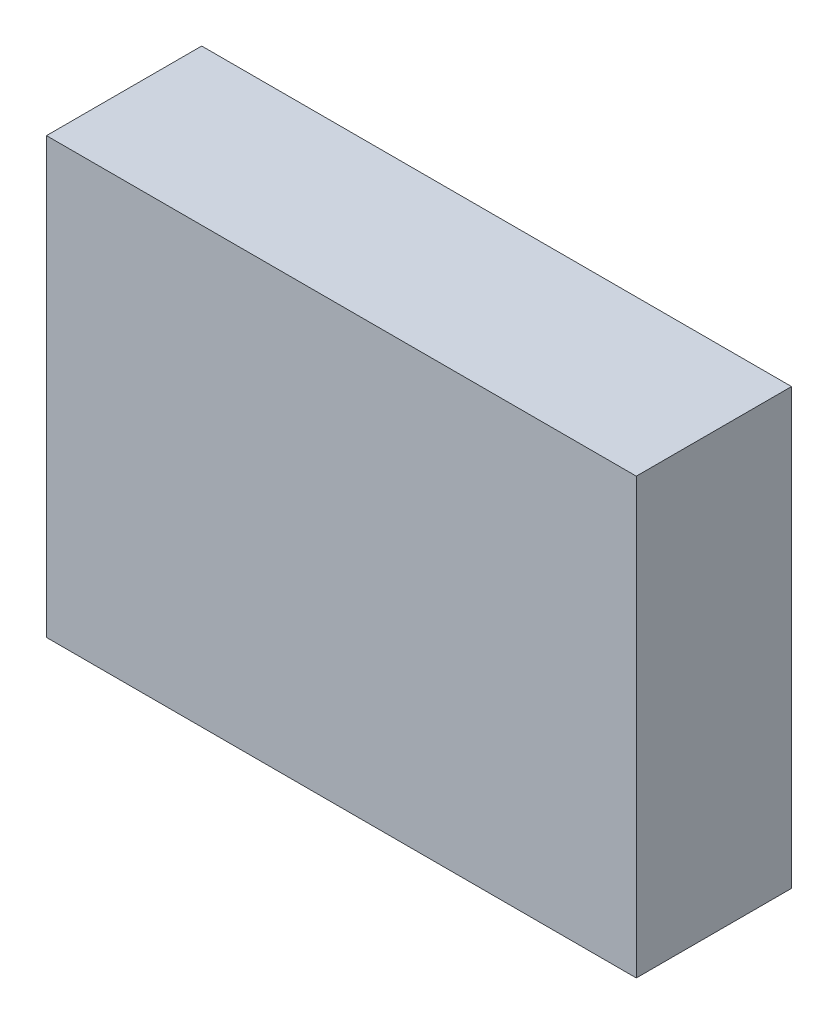
ISO-10303-21;
HEADER;
FILE_DESCRIPTION(('STEP AP214'),'2;1');
FILE_NAME('part.step','',(''),(''),'','','');
FILE_SCHEMA(('AUTOMOTIVE_DESIGN { 1 0 10303 214 1 1 1 1 }'));
ENDSEC;
DATA;
#1=APPLICATION_CONTEXT('core data for automotive mechanical design processes');
#2=APPLICATION_PROTOCOL_DEFINITION('international standard','automotive_design',2000,#1);
#3=PRODUCT_CONTEXT('',#1,'mechanical');
#4=PRODUCT('Part','Part','',(#3));
#5=PRODUCT_RELATED_PRODUCT_CATEGORY('part','',(#4));
#6=PRODUCT_DEFINITION_FORMATION('','',#4);
#7=PRODUCT_DEFINITION_CONTEXT('part definition',#1,'design');
#8=PRODUCT_DEFINITION('design','',#6,#7);
#9=PRODUCT_DEFINITION_SHAPE('','',#8);
#10=(LENGTH_UNIT() NAMED_UNIT(*) SI_UNIT(.MILLI.,.METRE.));
#11=(NAMED_UNIT(*) PLANE_ANGLE_UNIT() SI_UNIT($,.RADIAN.));
#12=(NAMED_UNIT(*) SI_UNIT($,.STERADIAN.) SOLID_ANGLE_UNIT());
#13=UNCERTAINTY_MEASURE_WITH_UNIT(LENGTH_MEASURE(1.E-05),#10,'distance_accuracy_value','');
#14=(GEOMETRIC_REPRESENTATION_CONTEXT(3) GLOBAL_UNCERTAINTY_ASSIGNED_CONTEXT((#13)) GLOBAL_UNIT_ASSIGNED_CONTEXT((#10,
#11,#12)) REPRESENTATION_CONTEXT('',''));
#15=CARTESIAN_POINT('',(0.,0.,0.));
#16=DIRECTION('',(0.,0.,1.));
#17=DIRECTION('',(1.,0.,0.));
#18=AXIS2_PLACEMENT_3D('',#15,#16,#17);
#19=CARTESIAN_POINT('',(95.,-70.,50.));
#20=DIRECTION('',(-1.,0.,0.));
#21=DIRECTION('',(0.,0.,1.));
#22=AXIS2_PLACEMENT_3D('',#19,#20,#21);
#23=PLANE('',#22);
#24=DIRECTION('',(0.,1.,0.));
#25=VECTOR('',#24,1.);
#26=CARTESIAN_POINT('',(95.,-70.,0.));
#27=LINE('',#26,#25);
#28=CARTESIAN_POINT('',(95.,-70.,0.));
#29=VERTEX_POINT('',#28);
#30=CARTESIAN_POINT('',(95.,70.,0.));
#31=VERTEX_POINT('',#30);
#32=EDGE_CURVE('E96',#29,#31,#27,.T.);
#33=ORIENTED_EDGE('',*,*,#32,.T.);
#34=DIRECTION('',(0.,0.,-1.));
#35=VECTOR('',#34,1.);
#36=CARTESIAN_POINT('',(95.,70.,50.));
#37=LINE('',#36,#35);
#38=CARTESIAN_POINT('',(95.,70.,50.));
#39=VERTEX_POINT('',#38);
#40=EDGE_CURVE('E11',#39,#31,#37,.T.);
#41=ORIENTED_EDGE('',*,*,#40,.F.);
#42=DIRECTION('',(0.,1.,0.));
#43=VECTOR('',#42,1.);
#44=CARTESIAN_POINT('',(95.,-70.,50.));
#45=LINE('',#44,#43);
#46=CARTESIAN_POINT('',(95.,-70.,50.));
#47=VERTEX_POINT('',#46);
#48=EDGE_CURVE('E84',#47,#39,#45,.T.);
#49=ORIENTED_EDGE('',*,*,#48,.F.);
#50=DIRECTION('',(0.,0.,-1.));
#51=VECTOR('',#50,1.);
#52=CARTESIAN_POINT('',(95.,-70.,50.));
#53=LINE('',#52,#51);
#54=EDGE_CURVE('E92',#47,#29,#53,.T.);
#55=ORIENTED_EDGE('',*,*,#54,.T.);
#56=EDGE_LOOP('',(#33,#41,#49,#55));
#57=FACE_BOUND('',#56,.T.);
#58=ADVANCED_FACE('F33',(#57),#23,.F.);
#59=CARTESIAN_POINT('',(-95.,70.,50.));
#60=DIRECTION('',(0.,-1.,0.));
#61=DIRECTION('',(0.,0.,-1.));
#62=AXIS2_PLACEMENT_3D('',#59,#60,#61);
#63=PLANE('',#62);
#64=DIRECTION('',(-1.,0.,0.));
#65=VECTOR('',#64,1.);
#66=CARTESIAN_POINT('',(-95.,70.,0.));
#67=LINE('',#66,#65);
#68=CARTESIAN_POINT('',(-95.,70.,0.));
#69=VERTEX_POINT('',#68);
#70=EDGE_CURVE('E88',#31,#69,#67,.T.);
#71=ORIENTED_EDGE('',*,*,#70,.T.);
#72=DIRECTION('',(0.,0.,-1.));
#73=VECTOR('',#72,1.);
#74=CARTESIAN_POINT('',(-95.,70.,50.));
#75=LINE('',#74,#73);
#76=CARTESIAN_POINT('',(-95.,70.,50.));
#77=VERTEX_POINT('',#76);
#78=EDGE_CURVE('E41',#77,#69,#75,.T.);
#79=ORIENTED_EDGE('',*,*,#78,.F.);
#80=DIRECTION('',(-1.,0.,0.));
#81=VECTOR('',#80,1.);
#82=CARTESIAN_POINT('',(-95.,70.,50.));
#83=LINE('',#82,#81);
#84=EDGE_CURVE('E79',#39,#77,#83,.T.);
#85=ORIENTED_EDGE('',*,*,#84,.F.);
#86=ORIENTED_EDGE('',*,*,#40,.T.);
#87=EDGE_LOOP('',(#71,#79,#85,#86));
#88=FACE_BOUND('',#87,.T.);
#89=ADVANCED_FACE('F87',(#88),#63,.F.);
#90=CARTESIAN_POINT('',(-95.,-70.,50.));
#91=DIRECTION('',(1.,0.,0.));
#92=DIRECTION('',(0.,0.,-1.));
#93=AXIS2_PLACEMENT_3D('',#90,#91,#92);
#94=PLANE('',#93);
#95=DIRECTION('',(0.,-1.,0.));
#96=VECTOR('',#95,1.);
#97=CARTESIAN_POINT('',(-95.,-70.,0.));
#98=LINE('',#97,#96);
#99=CARTESIAN_POINT('',(-95.,-70.,0.));
#100=VERTEX_POINT('',#99);
#101=EDGE_CURVE('E66',#69,#100,#98,.T.);
#102=ORIENTED_EDGE('',*,*,#101,.T.);
#103=DIRECTION('',(0.,0.,-1.));
#104=VECTOR('',#103,1.);
#105=CARTESIAN_POINT('',(-95.,-70.,50.));
#106=LINE('',#105,#104);
#107=CARTESIAN_POINT('',(-95.,-70.,50.));
#108=VERTEX_POINT('',#107);
#109=EDGE_CURVE('E89',#108,#100,#106,.T.);
#110=ORIENTED_EDGE('',*,*,#109,.F.);
#111=DIRECTION('',(0.,-1.,0.));
#112=VECTOR('',#111,1.);
#113=CARTESIAN_POINT('',(-95.,-70.,50.));
#114=LINE('',#113,#112);
#115=EDGE_CURVE('E82',#77,#108,#114,.T.);
#116=ORIENTED_EDGE('',*,*,#115,.F.);
#117=ORIENTED_EDGE('',*,*,#78,.T.);
#118=EDGE_LOOP('',(#102,#110,#116,#117));
#119=FACE_BOUND('',#118,.T.);
#120=ADVANCED_FACE('F90',(#119),#94,.F.);
#121=CARTESIAN_POINT('',(-95.,-70.,50.));
#122=DIRECTION('',(0.,1.,0.));
#123=DIRECTION('',(-1.,0.,0.));
#124=AXIS2_PLACEMENT_3D('',#121,#122,#123);
#125=PLANE('',#124);
#126=DIRECTION('',(1.,0.,0.));
#127=VECTOR('',#126,1.);
#128=CARTESIAN_POINT('',(-95.,-70.,0.));
#129=LINE('',#128,#127);
#130=EDGE_CURVE('E72',#100,#29,#129,.T.);
#131=ORIENTED_EDGE('',*,*,#130,.T.);
#132=ORIENTED_EDGE('',*,*,#54,.F.);
#133=DIRECTION('',(1.,0.,0.));
#134=VECTOR('',#133,1.);
#135=CARTESIAN_POINT('',(-95.,-70.,50.));
#136=LINE('',#135,#134);
#137=EDGE_CURVE('E49',#108,#47,#136,.T.);
#138=ORIENTED_EDGE('',*,*,#137,.F.);
#139=ORIENTED_EDGE('',*,*,#109,.T.);
#140=EDGE_LOOP('',(#131,#132,#138,#139));
#141=FACE_BOUND('',#140,.T.);
#142=ADVANCED_FACE('F103',(#141),#125,.F.);
#143=CARTESIAN_POINT('',(0.,0.,50.));
#144=DIRECTION('',(0.,0.,-1.));
#145=DIRECTION('',(-1.,0.,0.));
#146=AXIS2_PLACEMENT_3D('',#143,#144,#145);
#147=PLANE('',#146);
#148=ORIENTED_EDGE('',*,*,#48,.T.);
#149=ORIENTED_EDGE('',*,*,#84,.T.);
#150=ORIENTED_EDGE('',*,*,#115,.T.);
#151=ORIENTED_EDGE('',*,*,#137,.T.);
#152=EDGE_LOOP('',(#148,#149,#150,#151));
#153=FACE_BOUND('',#152,.T.);
#154=ADVANCED_FACE('F80',(#153),#147,.F.);
#155=CARTESIAN_POINT('',(0.,0.,0.));
#156=DIRECTION('',(0.,0.,-1.));
#157=DIRECTION('',(-1.,0.,0.));
#158=AXIS2_PLACEMENT_3D('',#155,#156,#157);
#159=PLANE('',#158);
#160=ORIENTED_EDGE('',*,*,#32,.F.);
#161=ORIENTED_EDGE('',*,*,#130,.F.);
#162=ORIENTED_EDGE('',*,*,#101,.F.);
#163=ORIENTED_EDGE('',*,*,#70,.F.);
#164=EDGE_LOOP('',(#160,#161,#162,#163));
#165=FACE_BOUND('',#164,.T.);
#166=ADVANCED_FACE('F106',(#165),#159,.T.);
#167=CLOSED_SHELL('',(#58,#89,#120,#142,#154,#166));
#168=MANIFOLD_SOLID_BREP('B2',#167);
#169=ADVANCED_BREP_SHAPE_REPRESENTATION('',(#18,#168),#14);
#170=SHAPE_DEFINITION_REPRESENTATION(#9,#169);
ENDSEC;
END-ISO-10303-21;
